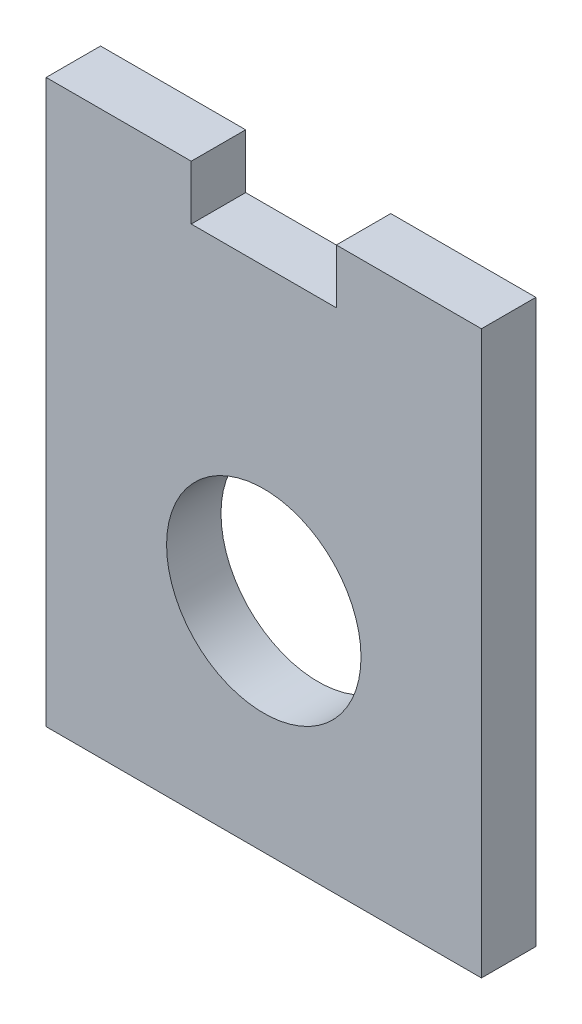
ISO-10303-21;
HEADER;
FILE_DESCRIPTION(('STEP AP214'),'2;1');
FILE_NAME('part.step','',(''),(''),'','','');
FILE_SCHEMA(('AUTOMOTIVE_DESIGN { 1 0 10303 214 1 1 1 1 }'));
ENDSEC;
DATA;
#1=APPLICATION_CONTEXT('core data for automotive mechanical design processes');
#2=APPLICATION_PROTOCOL_DEFINITION('international standard','automotive_design',2000,#1);
#3=PRODUCT_CONTEXT('',#1,'mechanical');
#4=PRODUCT('Part','Part','',(#3));
#5=PRODUCT_RELATED_PRODUCT_CATEGORY('part','',(#4));
#6=PRODUCT_DEFINITION_FORMATION('','',#4);
#7=PRODUCT_DEFINITION_CONTEXT('part definition',#1,'design');
#8=PRODUCT_DEFINITION('design','',#6,#7);
#9=PRODUCT_DEFINITION_SHAPE('','',#8);
#10=(LENGTH_UNIT() NAMED_UNIT(*) SI_UNIT(.MILLI.,.METRE.));
#11=(NAMED_UNIT(*) PLANE_ANGLE_UNIT() SI_UNIT($,.RADIAN.));
#12=(NAMED_UNIT(*) SI_UNIT($,.STERADIAN.) SOLID_ANGLE_UNIT());
#13=UNCERTAINTY_MEASURE_WITH_UNIT(LENGTH_MEASURE(1.E-05),#10,'distance_accuracy_value','');
#14=(GEOMETRIC_REPRESENTATION_CONTEXT(3) GLOBAL_UNCERTAINTY_ASSIGNED_CONTEXT((#13)) GLOBAL_UNIT_ASSIGNED_CONTEXT((#10,
#11,#12)) REPRESENTATION_CONTEXT('',''));
#15=CARTESIAN_POINT('',(0.,0.,0.));
#16=DIRECTION('',(0.,0.,1.));
#17=DIRECTION('',(1.,0.,0.));
#18=AXIS2_PLACEMENT_3D('',#15,#16,#17);
#19=CARTESIAN_POINT('',(0.,0.,4.7625));
#20=DIRECTION('',(0.,0.,-1.));
#21=DIRECTION('',(-1.,0.,0.));
#22=AXIS2_PLACEMENT_3D('',#19,#20,#21);
#23=PLANE('',#22);
#24=DIRECTION('',(1.,0.,0.));
#25=VECTOR('',#24,1.);
#26=CARTESIAN_POINT('',(38.1,0.,4.7625));
#27=LINE('',#26,#25);
#28=CARTESIAN_POINT('',(0.,0.,4.7625));
#29=VERTEX_POINT('',#28);
#30=CARTESIAN_POINT('',(38.1,0.,4.7625));
#31=VERTEX_POINT('',#30);
#32=EDGE_CURVE('E145',#29,#31,#27,.T.);
#33=ORIENTED_EDGE('',*,*,#32,.T.);
#34=DIRECTION('',(0.,1.,0.));
#35=VECTOR('',#34,1.);
#36=CARTESIAN_POINT('',(38.1,49.2125,4.7625));
#37=LINE('',#36,#35);
#38=CARTESIAN_POINT('',(38.1,49.2125,4.7625));
#39=VERTEX_POINT('',#38);
#40=EDGE_CURVE('E93',#31,#39,#37,.T.);
#41=ORIENTED_EDGE('',*,*,#40,.T.);
#42=DIRECTION('',(-1.,0.,0.));
#43=VECTOR('',#42,1.);
#44=CARTESIAN_POINT('',(25.4,49.2125,4.7625));
#45=LINE('',#44,#43);
#46=CARTESIAN_POINT('',(25.4,49.2125,4.7625));
#47=VERTEX_POINT('',#46);
#48=EDGE_CURVE('E160',#39,#47,#45,.T.);
#49=ORIENTED_EDGE('',*,*,#48,.T.);
#50=DIRECTION('',(0.,-1.,0.));
#51=VECTOR('',#50,1.);
#52=CARTESIAN_POINT('',(25.4,44.45,4.7625));
#53=LINE('',#52,#51);
#54=CARTESIAN_POINT('',(25.4,44.45,4.7625));
#55=VERTEX_POINT('',#54);
#56=EDGE_CURVE('E173',#47,#55,#53,.T.);
#57=ORIENTED_EDGE('',*,*,#56,.T.);
#58=DIRECTION('',(-1.,0.,0.));
#59=VECTOR('',#58,1.);
#60=CARTESIAN_POINT('',(12.7,44.45,4.7625));
#61=LINE('',#60,#59);
#62=CARTESIAN_POINT('',(12.7,44.45,4.7625));
#63=VERTEX_POINT('',#62);
#64=EDGE_CURVE('E112',#55,#63,#61,.T.);
#65=ORIENTED_EDGE('',*,*,#64,.T.);
#66=DIRECTION('',(0.,1.,0.));
#67=VECTOR('',#66,1.);
#68=CARTESIAN_POINT('',(12.7,49.2125,4.7625));
#69=LINE('',#68,#67);
#70=CARTESIAN_POINT('',(12.7,49.2125,4.7625));
#71=VERTEX_POINT('',#70);
#72=EDGE_CURVE('E106',#63,#71,#69,.T.);
#73=ORIENTED_EDGE('',*,*,#72,.T.);
#74=DIRECTION('',(-1.,0.,0.));
#75=VECTOR('',#74,1.);
#76=CARTESIAN_POINT('',(0.,49.2125,4.7625));
#77=LINE('',#76,#75);
#78=CARTESIAN_POINT('',(0.,49.2125,4.7625));
#79=VERTEX_POINT('',#78);
#80=EDGE_CURVE('E110',#71,#79,#77,.T.);
#81=ORIENTED_EDGE('',*,*,#80,.T.);
#82=DIRECTION('',(0.,-1.,0.));
#83=VECTOR('',#82,1.);
#84=CARTESIAN_POINT('',(0.,0.,4.7625));
#85=LINE('',#84,#83);
#86=EDGE_CURVE('E50',#79,#29,#85,.T.);
#87=ORIENTED_EDGE('',*,*,#86,.T.);
#88=EDGE_LOOP('',(#33,#41,#49,#57,#65,#73,#81,#87));
#89=FACE_BOUND('',#88,.T.);
#90=CARTESIAN_POINT('',(19.05,19.05,4.7625));
#91=DIRECTION('',(0.,0.,1.));
#92=DIRECTION('',(1.,0.,0.));
#93=AXIS2_PLACEMENT_3D('',#90,#91,#92);
#94=CIRCLE('',#93,8.509);
#95=CARTESIAN_POINT('',(10.541,19.05,4.7625));
#96=VERTEX_POINT('',#95);
#97=EDGE_CURVE('E134',#96,#96,#94,.T.);
#98=ORIENTED_EDGE('',*,*,#97,.F.);
#99=EDGE_LOOP('',(#98));
#100=FACE_BOUND('',#99,.T.);
#101=ADVANCED_FACE('F33',(#89,#100),#23,.F.);
#102=CARTESIAN_POINT('',(0.,0.,0.));
#103=DIRECTION('',(0.,0.,-1.));
#104=DIRECTION('',(-1.,0.,0.));
#105=AXIS2_PLACEMENT_3D('',#102,#103,#104);
#106=PLANE('',#105);
#107=DIRECTION('',(1.,0.,0.));
#108=VECTOR('',#107,1.);
#109=CARTESIAN_POINT('',(38.1,0.,0.));
#110=LINE('',#109,#108);
#111=CARTESIAN_POINT('',(0.,0.,0.));
#112=VERTEX_POINT('',#111);
#113=CARTESIAN_POINT('',(38.1,0.,0.));
#114=VERTEX_POINT('',#113);
#115=EDGE_CURVE('E130',#112,#114,#110,.T.);
#116=ORIENTED_EDGE('',*,*,#115,.F.);
#117=DIRECTION('',(0.,-1.,0.));
#118=VECTOR('',#117,1.);
#119=CARTESIAN_POINT('',(0.,0.,0.));
#120=LINE('',#119,#118);
#121=CARTESIAN_POINT('',(0.,49.2125,0.));
#122=VERTEX_POINT('',#121);
#123=EDGE_CURVE('E85',#122,#112,#120,.T.);
#124=ORIENTED_EDGE('',*,*,#123,.F.);
#125=DIRECTION('',(-1.,0.,0.));
#126=VECTOR('',#125,1.);
#127=CARTESIAN_POINT('',(0.,49.2125,0.));
#128=LINE('',#127,#126);
#129=CARTESIAN_POINT('',(12.7,49.2125,0.));
#130=VERTEX_POINT('',#129);
#131=EDGE_CURVE('E79',#130,#122,#128,.T.);
#132=ORIENTED_EDGE('',*,*,#131,.F.);
#133=DIRECTION('',(0.,1.,0.));
#134=VECTOR('',#133,1.);
#135=CARTESIAN_POINT('',(12.7,49.2125,0.));
#136=LINE('',#135,#134);
#137=CARTESIAN_POINT('',(12.7,44.45,0.));
#138=VERTEX_POINT('',#137);
#139=EDGE_CURVE('E120',#138,#130,#136,.T.);
#140=ORIENTED_EDGE('',*,*,#139,.F.);
#141=DIRECTION('',(-1.,0.,0.));
#142=VECTOR('',#141,1.);
#143=CARTESIAN_POINT('',(12.7,44.45,0.));
#144=LINE('',#143,#142);
#145=CARTESIAN_POINT('',(25.4,44.45,0.));
#146=VERTEX_POINT('',#145);
#147=EDGE_CURVE('E140',#146,#138,#144,.T.);
#148=ORIENTED_EDGE('',*,*,#147,.F.);
#149=DIRECTION('',(0.,-1.,0.));
#150=VECTOR('',#149,1.);
#151=CARTESIAN_POINT('',(25.4,44.45,0.));
#152=LINE('',#151,#150);
#153=CARTESIAN_POINT('',(25.4,49.2125,0.));
#154=VERTEX_POINT('',#153);
#155=EDGE_CURVE('E138',#154,#146,#152,.T.);
#156=ORIENTED_EDGE('',*,*,#155,.F.);
#157=DIRECTION('',(-1.,0.,0.));
#158=VECTOR('',#157,1.);
#159=CARTESIAN_POINT('',(25.4,49.2125,0.));
#160=LINE('',#159,#158);
#161=CARTESIAN_POINT('',(38.1,49.2125,0.));
#162=VERTEX_POINT('',#161);
#163=EDGE_CURVE('E136',#162,#154,#160,.T.);
#164=ORIENTED_EDGE('',*,*,#163,.F.);
#165=DIRECTION('',(0.,1.,0.));
#166=VECTOR('',#165,1.);
#167=CARTESIAN_POINT('',(38.1,49.2125,0.));
#168=LINE('',#167,#166);
#169=EDGE_CURVE('E133',#114,#162,#168,.T.);
#170=ORIENTED_EDGE('',*,*,#169,.F.);
#171=EDGE_LOOP('',(#116,#124,#132,#140,#148,#156,#164,#170));
#172=FACE_BOUND('',#171,.T.);
#173=CARTESIAN_POINT('',(19.05,19.05,0.));
#174=DIRECTION('',(0.,0.,1.));
#175=DIRECTION('',(1.,0.,0.));
#176=AXIS2_PLACEMENT_3D('',#173,#174,#175);
#177=CIRCLE('',#176,8.509);
#178=CARTESIAN_POINT('',(10.541,19.05,0.));
#179=VERTEX_POINT('',#178);
#180=EDGE_CURVE('E179',#179,#179,#177,.T.);
#181=ORIENTED_EDGE('',*,*,#180,.T.);
#182=EDGE_LOOP('',(#181));
#183=FACE_BOUND('',#182,.T.);
#184=ADVANCED_FACE('F164',(#172,#183),#106,.T.);
#185=CARTESIAN_POINT('',(38.1,0.,4.7625));
#186=DIRECTION('',(0.,1.,0.));
#187=DIRECTION('',(0.,0.,1.));
#188=AXIS2_PLACEMENT_3D('',#185,#186,#187);
#189=PLANE('',#188);
#190=ORIENTED_EDGE('',*,*,#115,.T.);
#191=DIRECTION('',(0.,0.,-1.));
#192=VECTOR('',#191,1.);
#193=CARTESIAN_POINT('',(38.1,0.,4.7625));
#194=LINE('',#193,#192);
#195=EDGE_CURVE('E11',#31,#114,#194,.T.);
#196=ORIENTED_EDGE('',*,*,#195,.F.);
#197=ORIENTED_EDGE('',*,*,#32,.F.);
#198=DIRECTION('',(0.,0.,-1.));
#199=VECTOR('',#198,1.);
#200=CARTESIAN_POINT('',(0.,0.,4.7625));
#201=LINE('',#200,#199);
#202=EDGE_CURVE('E126',#29,#112,#201,.T.);
#203=ORIENTED_EDGE('',*,*,#202,.T.);
#204=EDGE_LOOP('',(#190,#196,#197,#203));
#205=FACE_BOUND('',#204,.T.);
#206=ADVANCED_FACE('F35',(#205),#189,.F.);
#207=CARTESIAN_POINT('',(38.1,49.2125,4.7625));
#208=DIRECTION('',(-1.,0.,0.));
#209=DIRECTION('',(0.,0.,1.));
#210=AXIS2_PLACEMENT_3D('',#207,#208,#209);
#211=PLANE('',#210);
#212=ORIENTED_EDGE('',*,*,#169,.T.);
#213=DIRECTION('',(0.,0.,-1.));
#214=VECTOR('',#213,1.);
#215=CARTESIAN_POINT('',(38.1,49.2125,4.7625));
#216=LINE('',#215,#214);
#217=EDGE_CURVE('E42',#39,#162,#216,.T.);
#218=ORIENTED_EDGE('',*,*,#217,.F.);
#219=ORIENTED_EDGE('',*,*,#40,.F.);
#220=ORIENTED_EDGE('',*,*,#195,.T.);
#221=EDGE_LOOP('',(#212,#218,#219,#220));
#222=FACE_BOUND('',#221,.T.);
#223=ADVANCED_FACE('F207',(#222),#211,.F.);
#224=CARTESIAN_POINT('',(25.4,49.2125,4.7625));
#225=DIRECTION('',(0.,-1.,0.));
#226=DIRECTION('',(0.,0.,-1.));
#227=AXIS2_PLACEMENT_3D('',#224,#225,#226);
#228=PLANE('',#227);
#229=ORIENTED_EDGE('',*,*,#163,.T.);
#230=DIRECTION('',(0.,0.,-1.));
#231=VECTOR('',#230,1.);
#232=CARTESIAN_POINT('',(25.4,49.2125,4.7625));
#233=LINE('',#232,#231);
#234=EDGE_CURVE('E152',#47,#154,#233,.T.);
#235=ORIENTED_EDGE('',*,*,#234,.F.);
#236=ORIENTED_EDGE('',*,*,#48,.F.);
#237=ORIENTED_EDGE('',*,*,#217,.T.);
#238=EDGE_LOOP('',(#229,#235,#236,#237));
#239=FACE_BOUND('',#238,.T.);
#240=ADVANCED_FACE('F158',(#239),#228,.F.);
#241=CARTESIAN_POINT('',(25.4,44.45,4.7625));
#242=DIRECTION('',(1.,0.,0.));
#243=DIRECTION('',(0.,0.,-1.));
#244=AXIS2_PLACEMENT_3D('',#241,#242,#243);
#245=PLANE('',#244);
#246=ORIENTED_EDGE('',*,*,#155,.T.);
#247=DIRECTION('',(0.,0.,-1.));
#248=VECTOR('',#247,1.);
#249=CARTESIAN_POINT('',(25.4,44.45,4.7625));
#250=LINE('',#249,#248);
#251=EDGE_CURVE('E149',#55,#146,#250,.T.);
#252=ORIENTED_EDGE('',*,*,#251,.F.);
#253=ORIENTED_EDGE('',*,*,#56,.F.);
#254=ORIENTED_EDGE('',*,*,#234,.T.);
#255=EDGE_LOOP('',(#246,#252,#253,#254));
#256=FACE_BOUND('',#255,.T.);
#257=ADVANCED_FACE('F169',(#256),#245,.F.);
#258=CARTESIAN_POINT('',(12.7,44.45,4.7625));
#259=DIRECTION('',(0.,-1.,0.));
#260=DIRECTION('',(0.,0.,-1.));
#261=AXIS2_PLACEMENT_3D('',#258,#259,#260);
#262=PLANE('',#261);
#263=ORIENTED_EDGE('',*,*,#147,.T.);
#264=DIRECTION('',(0.,0.,-1.));
#265=VECTOR('',#264,1.);
#266=CARTESIAN_POINT('',(12.7,44.45,4.7625));
#267=LINE('',#266,#265);
#268=EDGE_CURVE('E121',#63,#138,#267,.T.);
#269=ORIENTED_EDGE('',*,*,#268,.F.);
#270=ORIENTED_EDGE('',*,*,#64,.F.);
#271=ORIENTED_EDGE('',*,*,#251,.T.);
#272=EDGE_LOOP('',(#263,#269,#270,#271));
#273=FACE_BOUND('',#272,.T.);
#274=ADVANCED_FACE('F172',(#273),#262,.F.);
#275=CARTESIAN_POINT('',(12.7,49.2125,4.7625));
#276=DIRECTION('',(-1.,0.,0.));
#277=DIRECTION('',(0.,0.,1.));
#278=AXIS2_PLACEMENT_3D('',#275,#276,#277);
#279=PLANE('',#278);
#280=ORIENTED_EDGE('',*,*,#139,.T.);
#281=DIRECTION('',(0.,0.,-1.));
#282=VECTOR('',#281,1.);
#283=CARTESIAN_POINT('',(12.7,49.2125,4.7625));
#284=LINE('',#283,#282);
#285=EDGE_CURVE('E117',#71,#130,#284,.T.);
#286=ORIENTED_EDGE('',*,*,#285,.F.);
#287=ORIENTED_EDGE('',*,*,#72,.F.);
#288=ORIENTED_EDGE('',*,*,#268,.T.);
#289=EDGE_LOOP('',(#280,#286,#287,#288));
#290=FACE_BOUND('',#289,.T.);
#291=ADVANCED_FACE('F118',(#290),#279,.F.);
#292=CARTESIAN_POINT('',(0.,49.2125,4.7625));
#293=DIRECTION('',(0.,-1.,0.));
#294=DIRECTION('',(1.,0.,0.));
#295=AXIS2_PLACEMENT_3D('',#292,#293,#294);
#296=PLANE('',#295);
#297=ORIENTED_EDGE('',*,*,#131,.T.);
#298=DIRECTION('',(0.,0.,-1.));
#299=VECTOR('',#298,1.);
#300=CARTESIAN_POINT('',(0.,49.2125,4.7625));
#301=LINE('',#300,#299);
#302=EDGE_CURVE('E122',#79,#122,#301,.T.);
#303=ORIENTED_EDGE('',*,*,#302,.F.);
#304=ORIENTED_EDGE('',*,*,#80,.F.);
#305=ORIENTED_EDGE('',*,*,#285,.T.);
#306=EDGE_LOOP('',(#297,#303,#304,#305));
#307=FACE_BOUND('',#306,.T.);
#308=ADVANCED_FACE('F124',(#307),#296,.F.);
#309=CARTESIAN_POINT('',(0.,0.,4.7625));
#310=DIRECTION('',(1.,0.,0.));
#311=DIRECTION('',(0.,0.,-1.));
#312=AXIS2_PLACEMENT_3D('',#309,#310,#311);
#313=PLANE('',#312);
#314=ORIENTED_EDGE('',*,*,#123,.T.);
#315=ORIENTED_EDGE('',*,*,#202,.F.);
#316=ORIENTED_EDGE('',*,*,#86,.F.);
#317=ORIENTED_EDGE('',*,*,#302,.T.);
#318=EDGE_LOOP('',(#314,#315,#316,#317));
#319=FACE_BOUND('',#318,.T.);
#320=ADVANCED_FACE('F195',(#319),#313,.F.);
#321=CARTESIAN_POINT('',(19.05,19.05,4.7625));
#322=DIRECTION('',(0.,0.,-1.));
#323=DIRECTION('',(-1.,0.,0.));
#324=AXIS2_PLACEMENT_3D('',#321,#322,#323);
#325=CYLINDRICAL_SURFACE('',#324,8.509);
#326=CARTESIAN_POINT('',(10.541,19.05,4.7625));
#327=CARTESIAN_POINT('',(10.541,19.05,4.712890625));
#328=CARTESIAN_POINT('',(10.541,19.05,4.66328125));
#329=CARTESIAN_POINT('',(10.541,19.05,4.5640625));
#330=CARTESIAN_POINT('',(10.541,19.05,4.514453125));
#331=CARTESIAN_POINT('',(10.541,19.05,4.415234375));
#332=CARTESIAN_POINT('',(10.541,19.05,4.365625));
#333=CARTESIAN_POINT('',(10.541,19.05,4.26640625));
#334=CARTESIAN_POINT('',(10.541,19.05,4.216796875));
#335=CARTESIAN_POINT('',(10.541,19.05,4.117578125));
#336=CARTESIAN_POINT('',(10.541,19.05,4.06796875));
#337=CARTESIAN_POINT('',(10.541,19.05,3.96875));
#338=CARTESIAN_POINT('',(10.541,19.05,3.919140625));
#339=CARTESIAN_POINT('',(10.541,19.05,3.819921875));
#340=CARTESIAN_POINT('',(10.541,19.05,3.7703125));
#341=CARTESIAN_POINT('',(10.541,19.05,3.67109375));
#342=CARTESIAN_POINT('',(10.541,19.05,3.621484375));
#343=CARTESIAN_POINT('',(10.541,19.05,3.522265625));
#344=CARTESIAN_POINT('',(10.541,19.05,3.47265625));
#345=CARTESIAN_POINT('',(10.541,19.05,3.3734375));
#346=CARTESIAN_POINT('',(10.541,19.05,3.323828125));
#347=CARTESIAN_POINT('',(10.541,19.05,3.224609375));
#348=CARTESIAN_POINT('',(10.541,19.05,3.175));
#349=CARTESIAN_POINT('',(10.541,19.05,3.07578125));
#350=CARTESIAN_POINT('',(10.541,19.05,3.026171875));
#351=CARTESIAN_POINT('',(10.541,19.05,2.926953125));
#352=CARTESIAN_POINT('',(10.541,19.05,2.87734375));
#353=CARTESIAN_POINT('',(10.541,19.05,2.778125));
#354=CARTESIAN_POINT('',(10.541,19.05,2.728515625));
#355=CARTESIAN_POINT('',(10.541,19.05,2.629296875));
#356=CARTESIAN_POINT('',(10.541,19.05,2.5796875));
#357=CARTESIAN_POINT('',(10.541,19.05,2.48046875));
#358=CARTESIAN_POINT('',(10.541,19.05,2.430859375));
#359=CARTESIAN_POINT('',(10.541,19.05,2.331640625));
#360=CARTESIAN_POINT('',(10.541,19.05,2.28203125));
#361=CARTESIAN_POINT('',(10.541,19.05,2.1828125));
#362=CARTESIAN_POINT('',(10.541,19.05,2.133203125));
#363=CARTESIAN_POINT('',(10.541,19.05,2.033984375));
#364=CARTESIAN_POINT('',(10.541,19.05,1.984375));
#365=CARTESIAN_POINT('',(10.541,19.05,1.88515625));
#366=CARTESIAN_POINT('',(10.541,19.05,1.835546875));
#367=CARTESIAN_POINT('',(10.541,19.05,1.736328125));
#368=CARTESIAN_POINT('',(10.541,19.05,1.68671875));
#369=CARTESIAN_POINT('',(10.541,19.05,1.5875));
#370=CARTESIAN_POINT('',(10.541,19.05,1.537890625));
#371=CARTESIAN_POINT('',(10.541,19.05,1.438671875));
#372=CARTESIAN_POINT('',(10.541,19.05,1.3890625));
#373=CARTESIAN_POINT('',(10.541,19.05,1.28984375));
#374=CARTESIAN_POINT('',(10.541,19.05,1.240234375));
#375=CARTESIAN_POINT('',(10.541,19.05,1.141015625));
#376=CARTESIAN_POINT('',(10.541,19.05,1.09140625));
#377=CARTESIAN_POINT('',(10.541,19.05,0.992187499999999));
#378=CARTESIAN_POINT('',(10.541,19.05,0.942578124999999));
#379=CARTESIAN_POINT('',(10.541,19.05,0.843359375));
#380=CARTESIAN_POINT('',(10.541,19.05,0.79375));
#381=CARTESIAN_POINT('',(10.541,19.05,0.69453125));
#382=CARTESIAN_POINT('',(10.541,19.05,0.644921875));
#383=CARTESIAN_POINT('',(10.541,19.05,0.545703125));
#384=CARTESIAN_POINT('',(10.541,19.05,0.49609375));
#385=CARTESIAN_POINT('',(10.541,19.05,0.396875));
#386=CARTESIAN_POINT('',(10.541,19.05,0.347265625));
#387=CARTESIAN_POINT('',(10.541,19.05,0.248046875));
#388=CARTESIAN_POINT('',(10.541,19.05,0.1984375));
#389=CARTESIAN_POINT('',(10.541,19.05,0.09921875));
#390=CARTESIAN_POINT('',(10.541,19.05,0.049609375));
#391=CARTESIAN_POINT('',(10.541,19.05,0.));
#392=B_SPLINE_CURVE_WITH_KNOTS('',3,(#326,#327,#328,#329,#330,#331,#332,#333,#334,#335,#336,
#337,#338,#339,#340,#341,#342,#343,#344,#345,#346,#347,#348,#349,#350,#351,#352,#353,#354,#355,
#356,#357,#358,#359,#360,#361,#362,#363,#364,#365,#366,#367,#368,#369,#370,#371,#372,#373,#374,
#375,#376,#377,#378,#379,#380,#381,#382,#383,#384,#385,#386,#387,#388,#389,#390,#391),
.UNSPECIFIED.,.F.,.F.,(4,2,2,2,2,2,2,2,2,2,2,2,2,2,2,2,2,2,2,2,2,2,2,2,2,2,2,2,2,2,2,2,4),(0.,
0.148828125,0.29765625,0.446484375,0.5953125,0.744140625,0.892968750000001,1.041796875,1.190625,
1.339453125,1.48828125,1.637109375,1.7859375,1.934765625,2.08359375,2.232421875,2.38125,
2.530078125,2.67890625,2.827734375,2.9765625,3.125390625,3.27421875,3.423046875,3.571875,
3.720703125,3.86953125,4.018359375,4.1671875,4.316015625,4.46484375,4.613671875,4.7625),.UNSPECIFIED.);
#393=EDGE_CURVE('BSEAM185',#96,#179,#392,.T.);
#394=ORIENTED_EDGE('',*,*,#97,.T.);
#395=ORIENTED_EDGE('',*,*,#180,.F.);
#396=ORIENTED_EDGE('',*,*,#393,.T.);
#397=ORIENTED_EDGE('',*,*,#393,.F.);
#398=EDGE_LOOP('',(#394,#396,#395,#397));
#399=FACE_BOUND('',#398,.T.);
#400=ADVANCED_FACE('F185',(#399),#325,.F.);
#401=CLOSED_SHELL('',(#101,#184,#206,#223,#240,#257,#274,#291,#308,#320,#400));
#402=MANIFOLD_SOLID_BREP('B2',#401);
#403=ADVANCED_BREP_SHAPE_REPRESENTATION('',(#18,#402),#14);
#404=SHAPE_DEFINITION_REPRESENTATION(#9,#403);
ENDSEC;
END-ISO-10303-21;
